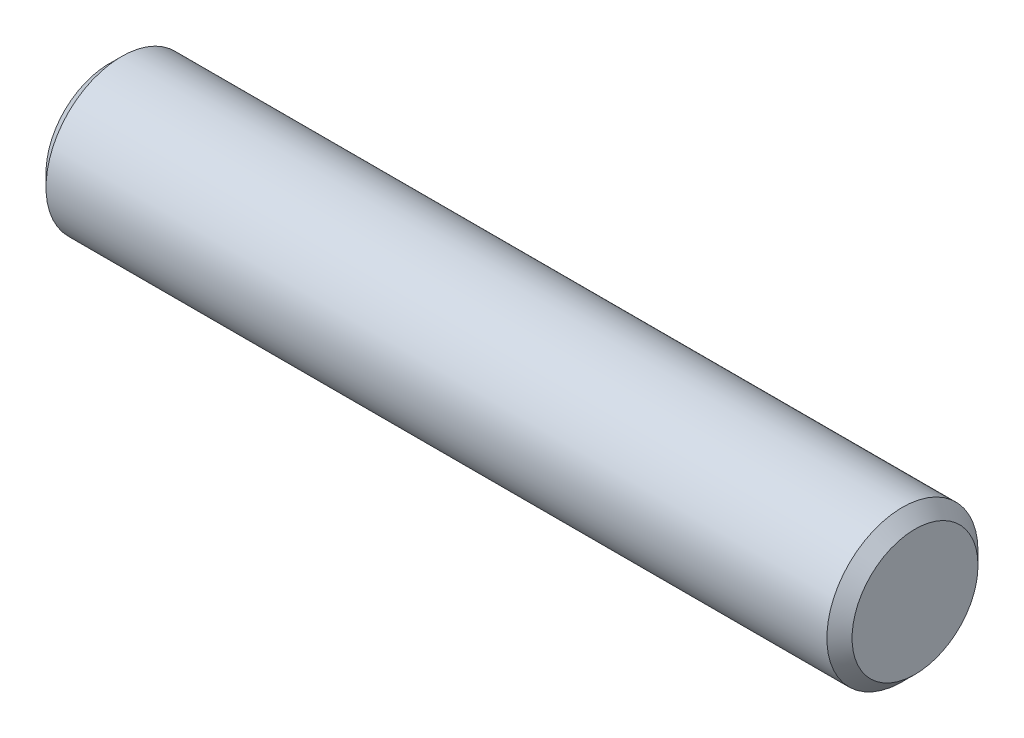
ISO-10303-21;
HEADER;
FILE_DESCRIPTION(('STEP AP214'),'2;1');
FILE_NAME('part.step','',(''),(''),'','','');
FILE_SCHEMA(('AUTOMOTIVE_DESIGN { 1 0 10303 214 1 1 1 1 }'));
ENDSEC;
DATA;
#1=APPLICATION_CONTEXT('core data for automotive mechanical design processes');
#2=APPLICATION_PROTOCOL_DEFINITION('international standard','automotive_design',2000,#1);
#3=PRODUCT_CONTEXT('',#1,'mechanical');
#4=PRODUCT('Part','Part','',(#3));
#5=PRODUCT_RELATED_PRODUCT_CATEGORY('part','',(#4));
#6=PRODUCT_DEFINITION_FORMATION('','',#4);
#7=PRODUCT_DEFINITION_CONTEXT('part definition',#1,'design');
#8=PRODUCT_DEFINITION('design','',#6,#7);
#9=PRODUCT_DEFINITION_SHAPE('','',#8);
#10=(LENGTH_UNIT() NAMED_UNIT(*) SI_UNIT(.MILLI.,.METRE.));
#11=(NAMED_UNIT(*) PLANE_ANGLE_UNIT() SI_UNIT($,.RADIAN.));
#12=(NAMED_UNIT(*) SI_UNIT($,.STERADIAN.) SOLID_ANGLE_UNIT());
#13=UNCERTAINTY_MEASURE_WITH_UNIT(LENGTH_MEASURE(1.E-05),#10,'distance_accuracy_value','');
#14=(GEOMETRIC_REPRESENTATION_CONTEXT(3) GLOBAL_UNCERTAINTY_ASSIGNED_CONTEXT((#13)) GLOBAL_UNIT_ASSIGNED_CONTEXT((#10,
#11,#12)) REPRESENTATION_CONTEXT('',''));
#15=CARTESIAN_POINT('',(0.,0.,0.));
#16=DIRECTION('',(0.,0.,1.));
#17=DIRECTION('',(1.,0.,0.));
#18=AXIS2_PLACEMENT_3D('',#15,#16,#17);
#19=CARTESIAN_POINT('',(16.,0.,0.));
#20=DIRECTION('',(-1.,0.,0.));
#21=DIRECTION('',(0.,0.,1.00000000000001));
#22=AXIS2_PLACEMENT_3D('',#19,#20,#21);
#23=CYLINDRICAL_SURFACE('',#22,3.);
#24=CARTESIAN_POINT('',(-15.5,0.,0.));
#25=DIRECTION('',(1.,0.,0.));
#26=DIRECTION('',(0.,0.,-1.00000000000001));
#27=AXIS2_PLACEMENT_3D('',#24,#25,#26);
#28=CIRCLE('',#27,3.);
#29=CARTESIAN_POINT('',(-15.5,0.,-3.00000000000002));
#30=VERTEX_POINT('',#29);
#31=EDGE_CURVE('E55',#30,#30,#28,.T.);
#32=ORIENTED_EDGE('',*,*,#31,.T.);
#33=EDGE_LOOP('',(#32));
#34=FACE_BOUND('',#33,.T.);
#35=CARTESIAN_POINT('',(15.5,0.,0.));
#36=DIRECTION('',(1.,0.,0.));
#37=DIRECTION('',(0.,0.,-1.00000000000001));
#38=AXIS2_PLACEMENT_3D('',#35,#36,#37);
#39=CIRCLE('',#38,3.);
#40=CARTESIAN_POINT('',(15.5,0.,-3.00000000000002));
#41=VERTEX_POINT('',#40);
#42=EDGE_CURVE('E61',#41,#41,#39,.F.);
#43=ORIENTED_EDGE('',*,*,#42,.T.);
#44=EDGE_LOOP('',(#43));
#45=FACE_BOUND('',#44,.T.);
#46=ADVANCED_FACE('F40',(#34,#45),#23,.T.);
#47=CARTESIAN_POINT('',(16.,0.,0.));
#48=DIRECTION('',(1.,0.,0.));
#49=DIRECTION('',(0.,0.,-1.00000000000001));
#50=AXIS2_PLACEMENT_3D('',#47,#48,#49);
#51=PLANE('',#50);
#52=CARTESIAN_POINT('',(16.,0.,0.));
#53=DIRECTION('',(1.,0.,0.));
#54=DIRECTION('',(0.,0.,-1.00000000000001));
#55=AXIS2_PLACEMENT_3D('',#52,#53,#54);
#56=CIRCLE('',#55,2.50000000000001);
#57=CARTESIAN_POINT('',(16.,0.,-2.50000000000002));
#58=VERTEX_POINT('',#57);
#59=EDGE_CURVE('E10',#58,#58,#56,.T.);
#60=ORIENTED_EDGE('',*,*,#59,.T.);
#61=EDGE_LOOP('',(#60));
#62=FACE_BOUND('',#61,.T.);
#63=ADVANCED_FACE('F79',(#62),#51,.T.);
#64=CARTESIAN_POINT('',(-16.,0.,0.));
#65=DIRECTION('',(1.,0.,0.));
#66=DIRECTION('',(0.,0.,-1.00000000000001));
#67=AXIS2_PLACEMENT_3D('',#64,#65,#66);
#68=PLANE('',#67);
#69=CARTESIAN_POINT('',(-16.,0.,0.));
#70=DIRECTION('',(1.,0.,0.));
#71=DIRECTION('',(0.,0.,-1.00000000000001));
#72=AXIS2_PLACEMENT_3D('',#69,#70,#71);
#73=CIRCLE('',#72,2.49999999999999);
#74=CARTESIAN_POINT('',(-16.,0.,-2.50000000000001));
#75=VERTEX_POINT('',#74);
#76=EDGE_CURVE('E49',#75,#75,#73,.F.);
#77=ORIENTED_EDGE('',*,*,#76,.T.);
#78=EDGE_LOOP('',(#77));
#79=FACE_BOUND('',#78,.T.);
#80=ADVANCED_FACE('F76',(#79),#68,.F.);
#81=CARTESIAN_POINT('',(-15.5,0.,0.));
#82=DIRECTION('',(1.,0.,0.));
#83=DIRECTION('',(0.,0.,-1.00000000000001));
#84=AXIS2_PLACEMENT_3D('',#81,#82,#83);
#85=CONICAL_SURFACE('',#84,3.,0.785398163397456);
#86=ORIENTED_EDGE('',*,*,#76,.F.);
#87=EDGE_LOOP('',(#86));
#88=FACE_BOUND('',#87,.T.);
#89=ORIENTED_EDGE('',*,*,#31,.F.);
#90=EDGE_LOOP('',(#89));
#91=FACE_BOUND('',#90,.T.);
#92=ADVANCED_FACE('F72',(#88,#91),#85,.T.);
#93=CARTESIAN_POINT('',(16.,0.,0.));
#94=DIRECTION('',(-1.,0.,0.));
#95=DIRECTION('',(0.,0.,1.00000000000001));
#96=AXIS2_PLACEMENT_3D('',#93,#94,#95);
#97=CONICAL_SURFACE('',#96,2.50000000000001,0.785398163397448);
#98=ORIENTED_EDGE('',*,*,#42,.F.);
#99=EDGE_LOOP('',(#98));
#100=FACE_BOUND('',#99,.T.);
#101=ORIENTED_EDGE('',*,*,#59,.F.);
#102=EDGE_LOOP('',(#101));
#103=FACE_BOUND('',#102,.T.);
#104=ADVANCED_FACE('F43',(#100,#103),#97,.T.);
#105=CLOSED_SHELL('',(#46,#63,#80,#92,#104));
#106=MANIFOLD_SOLID_BREP('B2',#105);
#107=ADVANCED_BREP_SHAPE_REPRESENTATION('',(#18,#106),#14);
#108=SHAPE_DEFINITION_REPRESENTATION(#9,#107);
ENDSEC;
END-ISO-10303-21;
